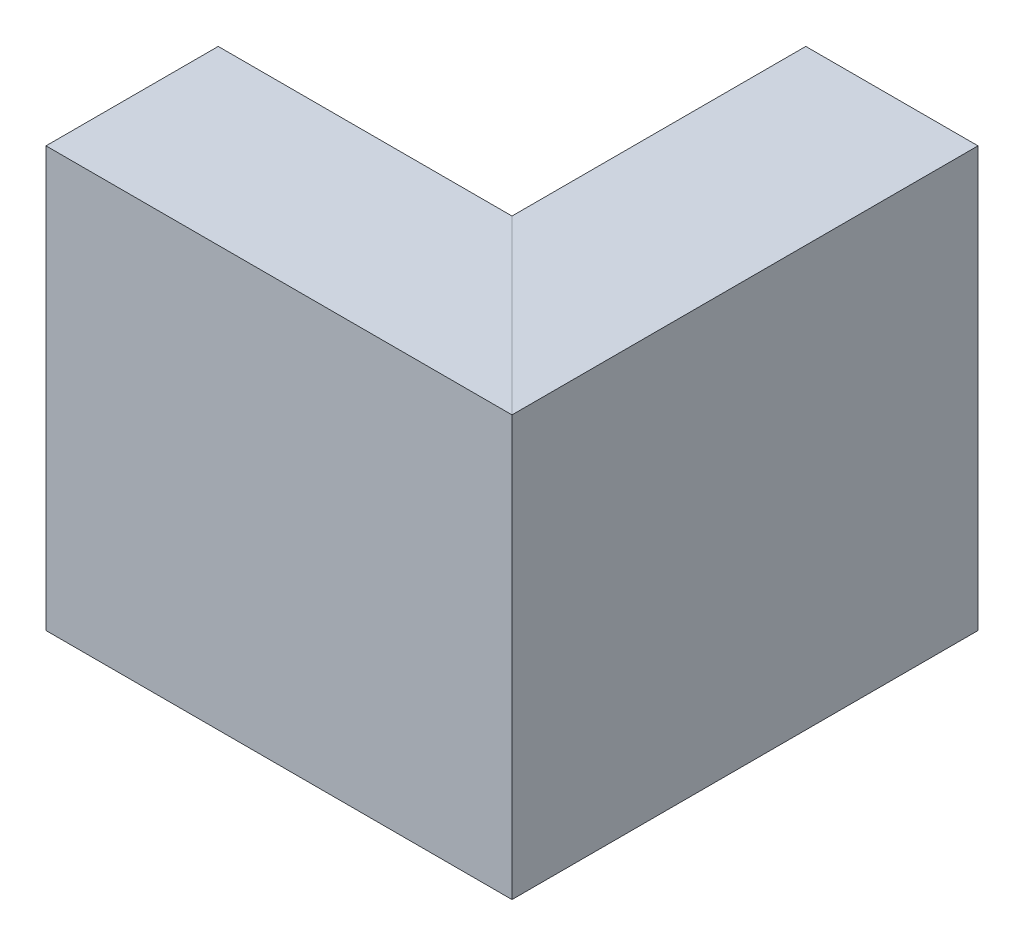
ISO-10303-21;
HEADER;
FILE_DESCRIPTION(('STEP AP214'),'2;1');
FILE_NAME('part.step','',(''),(''),'','','');
FILE_SCHEMA(('AUTOMOTIVE_DESIGN { 1 0 10303 214 1 1 1 1 }'));
ENDSEC;
DATA;
#1=APPLICATION_CONTEXT('core data for automotive mechanical design processes');
#2=APPLICATION_PROTOCOL_DEFINITION('international standard','automotive_design',2000,#1);
#3=PRODUCT_CONTEXT('',#1,'mechanical');
#4=PRODUCT('Part','Part','',(#3));
#5=PRODUCT_RELATED_PRODUCT_CATEGORY('part','',(#4));
#6=PRODUCT_DEFINITION_FORMATION('','',#4);
#7=PRODUCT_DEFINITION_CONTEXT('part definition',#1,'design');
#8=PRODUCT_DEFINITION('design','',#6,#7);
#9=PRODUCT_DEFINITION_SHAPE('','',#8);
#10=(LENGTH_UNIT() NAMED_UNIT(*) SI_UNIT(.MILLI.,.METRE.));
#11=(NAMED_UNIT(*) PLANE_ANGLE_UNIT() SI_UNIT($,.RADIAN.));
#12=(NAMED_UNIT(*) SI_UNIT($,.STERADIAN.) SOLID_ANGLE_UNIT());
#13=UNCERTAINTY_MEASURE_WITH_UNIT(LENGTH_MEASURE(1.E-05),#10,'distance_accuracy_value','');
#14=(GEOMETRIC_REPRESENTATION_CONTEXT(3) GLOBAL_UNCERTAINTY_ASSIGNED_CONTEXT((#13)) GLOBAL_UNIT_ASSIGNED_CONTEXT((#10,
#11,#12)) REPRESENTATION_CONTEXT('',''));
#15=CARTESIAN_POINT('',(0.,0.,0.));
#16=DIRECTION('',(0.,0.,1.));
#17=DIRECTION('',(1.,0.,0.));
#18=AXIS2_PLACEMENT_3D('',#15,#16,#17);
#19=CARTESIAN_POINT('',(4.849525,2.,14.73225));
#20=DIRECTION('',(0.,-0.0466159346990443,-0.998912886408086));
#21=DIRECTION('',(0.,0.998912886408087,-0.0466159346990443));
#22=AXIS2_PLACEMENT_3D('',#19,#20,#21);
#23=PLANE('',#22);
#24=DIRECTION('',(1.,0.,0.));
#25=VECTOR('',#24,1.);
#26=CARTESIAN_POINT('',(4.849525,0.,14.8255833333333));
#27=LINE('',#26,#25);
#28=CARTESIAN_POINT('',(-5.31775,0.,14.8255833333333));
#29=VERTEX_POINT('',#28);
#30=CARTESIAN_POINT('',(-4.22441666666667,0.,14.8255833333333));
#31=VERTEX_POINT('',#30);
#32=EDGE_CURVE('E60',#29,#31,#27,.T.);
#33=ORIENTED_EDGE('',*,*,#32,.F.);
#34=DIRECTION('',(0.,-0.998912886408087,0.0466159346990443));
#35=VECTOR('',#34,1.);
#36=CARTESIAN_POINT('',(-5.31775,2.,14.73225));
#37=LINE('',#36,#35);
#38=CARTESIAN_POINT('',(-5.31775,-22.225,15.86275));
#39=VERTEX_POINT('',#38);
#40=EDGE_CURVE('E201',#29,#39,#37,.T.);
#41=ORIENTED_EDGE('',*,*,#40,.T.);
#42=DIRECTION('',(-1.,0.,0.));
#43=VECTOR('',#42,1.);
#44=CARTESIAN_POINT('',(4.849525,-22.225,15.86275));
#45=LINE('',#44,#43);
#46=CARTESIAN_POINT('',(-19.05,-22.225,15.86275));
#47=VERTEX_POINT('',#46);
#48=EDGE_CURVE('E231',#39,#47,#45,.T.);
#49=ORIENTED_EDGE('',*,*,#48,.T.);
#50=DIRECTION('',(0.,-0.998912886408086,0.0466159346990443));
#51=VECTOR('',#50,1.);
#52=CARTESIAN_POINT('',(-19.05,2.,14.73225));
#53=LINE('',#52,#51);
#54=CARTESIAN_POINT('',(-19.05,2.,14.73225));
#55=VERTEX_POINT('',#54);
#56=EDGE_CURVE('E209',#55,#47,#53,.T.);
#57=ORIENTED_EDGE('',*,*,#56,.F.);
#58=DIRECTION('',(-1.,0.,0.));
#59=VECTOR('',#58,1.);
#60=CARTESIAN_POINT('',(4.849525,2.,14.73225));
#61=LINE('',#60,#59);
#62=CARTESIAN_POINT('',(-4.31775,2.,14.73225));
#63=VERTEX_POINT('',#62);
#64=EDGE_CURVE('E234',#63,#55,#61,.T.);
#65=ORIENTED_EDGE('',*,*,#64,.F.);
#66=DIRECTION('',(-0.046565367826734,0.997829310572866,-0.0465653678267339));
#67=VECTOR('',#66,1.);
#68=CARTESIAN_POINT('',(-4.34969443092309,2.68452351978051,14.7003055690769));
#69=LINE('',#68,#67);
#70=EDGE_CURVE('E274',#31,#63,#69,.T.);
#71=ORIENTED_EDGE('',*,*,#70,.F.);
#72=EDGE_LOOP('',(#33,#41,#49,#57,#65,#71));
#73=FACE_BOUND('',#72,.T.);
#74=ADVANCED_FACE('F39',(#73),#23,.T.);
#75=CARTESIAN_POINT('',(4.849525,-22.225,15.86275));
#76=DIRECTION('',(0.,-1.,0.));
#77=DIRECTION('',(0.,0.,-1.));
#78=AXIS2_PLACEMENT_3D('',#75,#76,#77);
#79=PLANE('',#78);
#80=ORIENTED_EDGE('',*,*,#48,.F.);
#81=DIRECTION('',(0.,0.,-1.));
#82=VECTOR('',#81,1.);
#83=CARTESIAN_POINT('',(-5.31775,-22.225,13.73225));
#84=LINE('',#83,#82);
#85=CARTESIAN_POINT('',(-5.31775,-22.225,17.7694166666667));
#86=VERTEX_POINT('',#85);
#87=EDGE_CURVE('E159',#86,#39,#84,.T.);
#88=ORIENTED_EDGE('',*,*,#87,.F.);
#89=DIRECTION('',(-1.,0.,0.));
#90=VECTOR('',#89,1.);
#91=CARTESIAN_POINT('',(4.849525,-22.225,17.7694166666667));
#92=LINE('',#91,#90);
#93=CARTESIAN_POINT('',(-19.05,-22.225,17.7694166666667));
#94=VERTEX_POINT('',#93);
#95=EDGE_CURVE('E228',#86,#94,#92,.T.);
#96=ORIENTED_EDGE('',*,*,#95,.T.);
#97=DIRECTION('',(0.,0.,1.));
#98=VECTOR('',#97,1.);
#99=CARTESIAN_POINT('',(-19.05,-22.225,15.86275));
#100=LINE('',#99,#98);
#101=EDGE_CURVE('E205',#47,#94,#100,.T.);
#102=ORIENTED_EDGE('',*,*,#101,.F.);
#103=EDGE_LOOP('',(#80,#88,#96,#102));
#104=FACE_BOUND('',#103,.T.);
#105=ADVANCED_FACE('F355',(#104),#79,.T.);
#106=CARTESIAN_POINT('',(4.849525,-22.225,17.7694166666667));
#107=DIRECTION('',(0.,0.0466159346990442,0.998912886408086));
#108=DIRECTION('',(0.,-0.998912886408087,0.0466159346990442));
#109=AXIS2_PLACEMENT_3D('',#106,#107,#108);
#110=PLANE('',#109);
#111=ORIENTED_EDGE('',*,*,#95,.F.);
#112=DIRECTION('',(0.,0.998912886408087,-0.0466159346990442));
#113=VECTOR('',#112,1.);
#114=CARTESIAN_POINT('',(-5.31775,-22.225,17.7694166666667));
#115=LINE('',#114,#113);
#116=CARTESIAN_POINT('',(-5.31775,0.,16.73225));
#117=VERTEX_POINT('',#116);
#118=EDGE_CURVE('E170',#86,#117,#115,.T.);
#119=ORIENTED_EDGE('',*,*,#118,.T.);
#120=DIRECTION('',(-1.,0.,0.));
#121=VECTOR('',#120,1.);
#122=CARTESIAN_POINT('',(4.849525,0.,16.73225));
#123=LINE('',#122,#121);
#124=CARTESIAN_POINT('',(-19.05,0.,16.73225));
#125=VERTEX_POINT('',#124);
#126=EDGE_CURVE('E225',#117,#125,#123,.T.);
#127=ORIENTED_EDGE('',*,*,#126,.T.);
#128=DIRECTION('',(0.,0.998912886408086,-0.0466159346990442));
#129=VECTOR('',#128,1.);
#130=CARTESIAN_POINT('',(-19.05,-22.225,17.7694166666667));
#131=LINE('',#130,#129);
#132=EDGE_CURVE('E200',#94,#125,#131,.T.);
#133=ORIENTED_EDGE('',*,*,#132,.F.);
#134=EDGE_LOOP('',(#111,#119,#127,#133));
#135=FACE_BOUND('',#134,.T.);
#136=ADVANCED_FACE('F359',(#135),#110,.T.);
#137=CARTESIAN_POINT('',(-1.28058333333333,-22.225,0.));
#138=DIRECTION('',(0.998912886408086,0.0466159346990442,0.));
#139=DIRECTION('',(-0.0466159346990442,0.998912886408086,0.));
#140=AXIS2_PLACEMENT_3D('',#137,#138,#139);
#141=PLANE('',#140);
#142=DIRECTION('',(0.,0.,1.));
#143=VECTOR('',#142,1.);
#144=CARTESIAN_POINT('',(-2.31775,0.,0.));
#145=LINE('',#144,#143);
#146=CARTESIAN_POINT('',(-2.31775,0.,0.));
#147=VERTEX_POINT('',#146);
#148=CARTESIAN_POINT('',(-2.31775,0.,13.73225));
#149=VERTEX_POINT('',#148);
#150=EDGE_CURVE('E168',#147,#149,#145,.T.);
#151=ORIENTED_EDGE('',*,*,#150,.T.);
#152=DIRECTION('',(0.0466159346990442,-0.998912886408086,0.));
#153=VECTOR('',#152,1.);
#154=CARTESIAN_POINT('',(-1.28058333333333,-22.225,13.73225));
#155=LINE('',#154,#153);
#156=CARTESIAN_POINT('',(-1.28058333333333,-22.225,13.73225));
#157=VERTEX_POINT('',#156);
#158=EDGE_CURVE('E152',#149,#157,#155,.T.);
#159=ORIENTED_EDGE('',*,*,#158,.T.);
#160=DIRECTION('',(0.,0.,1.));
#161=VECTOR('',#160,1.);
#162=CARTESIAN_POINT('',(-1.28058333333333,-22.225,0.));
#163=LINE('',#162,#161);
#164=CARTESIAN_POINT('',(-1.28058333333333,-22.225,0.));
#165=VERTEX_POINT('',#164);
#166=EDGE_CURVE('E166',#165,#157,#163,.T.);
#167=ORIENTED_EDGE('',*,*,#166,.F.);
#168=DIRECTION('',(-0.0466159346990442,0.998912886408086,0.));
#169=VECTOR('',#168,1.);
#170=CARTESIAN_POINT('',(-1.28058333333333,-22.225,0.));
#171=LINE('',#170,#169);
#172=EDGE_CURVE('E186',#165,#147,#171,.T.);
#173=ORIENTED_EDGE('',*,*,#172,.T.);
#174=EDGE_LOOP('',(#151,#159,#167,#173));
#175=FACE_BOUND('',#174,.T.);
#176=ADVANCED_FACE('F164',(#175),#141,.T.);
#177=CARTESIAN_POINT('',(-3.18725,-22.225,0.));
#178=DIRECTION('',(0.,-1.,0.));
#179=DIRECTION('',(1.,0.,0.));
#180=AXIS2_PLACEMENT_3D('',#177,#178,#179);
#181=PLANE('',#180);
#182=ORIENTED_EDGE('',*,*,#166,.T.);
#183=DIRECTION('',(1.,0.,0.));
#184=VECTOR('',#183,1.);
#185=CARTESIAN_POINT('',(-5.31775,-22.225,13.73225));
#186=LINE('',#185,#184);
#187=CARTESIAN_POINT('',(-3.18724999999999,-22.225,13.73225));
#188=VERTEX_POINT('',#187);
#189=EDGE_CURVE('E148',#188,#157,#186,.T.);
#190=ORIENTED_EDGE('',*,*,#189,.F.);
#191=DIRECTION('',(0.,0.,1.));
#192=VECTOR('',#191,1.);
#193=CARTESIAN_POINT('',(-3.18725,-22.225,0.));
#194=LINE('',#193,#192);
#195=CARTESIAN_POINT('',(-3.18725,-22.225,0.));
#196=VERTEX_POINT('',#195);
#197=EDGE_CURVE('E176',#196,#188,#194,.T.);
#198=ORIENTED_EDGE('',*,*,#197,.F.);
#199=DIRECTION('',(1.,0.,0.));
#200=VECTOR('',#199,1.);
#201=CARTESIAN_POINT('',(-3.18725,-22.225,0.));
#202=LINE('',#201,#200);
#203=EDGE_CURVE('E174',#196,#165,#202,.T.);
#204=ORIENTED_EDGE('',*,*,#203,.T.);
#205=EDGE_LOOP('',(#182,#190,#198,#204));
#206=FACE_BOUND('',#205,.T.);
#207=ADVANCED_FACE('F173',(#206),#181,.T.);
#208=CARTESIAN_POINT('',(-4.31775,2.,0.));
#209=DIRECTION('',(-0.998912886408086,-0.0466159346990443,0.));
#210=DIRECTION('',(0.0466159346990443,-0.998912886408086,0.));
#211=AXIS2_PLACEMENT_3D('',#208,#209,#210);
#212=PLANE('',#211);
#213=ORIENTED_EDGE('',*,*,#197,.T.);
#214=DIRECTION('',(-0.0466159346990443,0.998912886408086,0.));
#215=VECTOR('',#214,1.);
#216=CARTESIAN_POINT('',(-4.31775,2.,13.73225));
#217=LINE('',#216,#215);
#218=CARTESIAN_POINT('',(-4.22441666666667,0.,13.73225));
#219=VERTEX_POINT('',#218);
#220=EDGE_CURVE('E11',#188,#219,#217,.T.);
#221=ORIENTED_EDGE('',*,*,#220,.T.);
#222=DIRECTION('',(0.,0.,-1.));
#223=VECTOR('',#222,1.);
#224=CARTESIAN_POINT('',(-4.22441666666667,0.,0.));
#225=LINE('',#224,#223);
#226=EDGE_CURVE('E48',#31,#219,#225,.T.);
#227=ORIENTED_EDGE('',*,*,#226,.F.);
#228=ORIENTED_EDGE('',*,*,#70,.T.);
#229=DIRECTION('',(0.,0.,1.));
#230=VECTOR('',#229,1.);
#231=CARTESIAN_POINT('',(-4.31775,2.,0.));
#232=LINE('',#231,#230);
#233=CARTESIAN_POINT('',(-4.31775,2.,0.));
#234=VERTEX_POINT('',#233);
#235=EDGE_CURVE('E182',#234,#63,#232,.T.);
#236=ORIENTED_EDGE('',*,*,#235,.F.);
#237=DIRECTION('',(0.0466159346990443,-0.998912886408086,0.));
#238=VECTOR('',#237,1.);
#239=CARTESIAN_POINT('',(-4.31775,2.,0.));
#240=LINE('',#239,#238);
#241=EDGE_CURVE('E306',#234,#196,#240,.T.);
#242=ORIENTED_EDGE('',*,*,#241,.T.);
#243=EDGE_LOOP('',(#213,#221,#227,#228,#236,#242));
#244=FACE_BOUND('',#243,.T.);
#245=ADVANCED_FACE('F315',(#244),#212,.T.);
#246=CARTESIAN_POINT('',(-19.05,0.,19.05));
#247=DIRECTION('',(-1.,0.,0.));
#248=DIRECTION('',(0.,0.,1.));
#249=AXIS2_PLACEMENT_3D('',#246,#247,#248);
#250=PLANE('',#249);
#251=DIRECTION('',(0.,-1.,0.));
#252=VECTOR('',#251,1.);
#253=CARTESIAN_POINT('',(-19.05,0.,21.36775));
#254=LINE('',#253,#252);
#255=CARTESIAN_POINT('',(-19.05,0.,21.36775));
#256=VERTEX_POINT('',#255);
#257=CARTESIAN_POINT('',(-19.05,-19.05,21.36775));
#258=VERTEX_POINT('',#257);
#259=EDGE_CURVE('E222',#256,#258,#254,.T.);
#260=ORIENTED_EDGE('',*,*,#259,.T.);
#261=DIRECTION('',(0.,0.,1.));
#262=VECTOR('',#261,1.);
#263=CARTESIAN_POINT('',(-19.05,-19.05,21.36775));
#264=LINE('',#263,#262);
#265=CARTESIAN_POINT('',(-19.05,-19.05,23.36775));
#266=VERTEX_POINT('',#265);
#267=EDGE_CURVE('E219',#258,#266,#264,.T.);
#268=ORIENTED_EDGE('',*,*,#267,.T.);
#269=DIRECTION('',(0.,1.,0.));
#270=VECTOR('',#269,1.);
#271=CARTESIAN_POINT('',(-19.05,-19.05,23.36775));
#272=LINE('',#271,#270);
#273=CARTESIAN_POINT('',(-19.05,2.,23.36775));
#274=VERTEX_POINT('',#273);
#275=EDGE_CURVE('E216',#266,#274,#272,.T.);
#276=ORIENTED_EDGE('',*,*,#275,.T.);
#277=DIRECTION('',(0.,0.,-1.));
#278=VECTOR('',#277,1.);
#279=CARTESIAN_POINT('',(-19.05,2.,23.36775));
#280=LINE('',#279,#278);
#281=EDGE_CURVE('E213',#274,#55,#280,.T.);
#282=ORIENTED_EDGE('',*,*,#281,.T.);
#283=ORIENTED_EDGE('',*,*,#56,.T.);
#284=ORIENTED_EDGE('',*,*,#101,.T.);
#285=ORIENTED_EDGE('',*,*,#132,.T.);
#286=DIRECTION('',(0.,0.,1.));
#287=VECTOR('',#286,1.);
#288=CARTESIAN_POINT('',(-19.05,0.,16.73225));
#289=LINE('',#288,#287);
#290=EDGE_CURVE('E197',#125,#256,#289,.T.);
#291=ORIENTED_EDGE('',*,*,#290,.T.);
#292=EDGE_LOOP('',(#260,#268,#276,#282,#283,#284,#285,#291));
#293=FACE_BOUND('',#292,.T.);
#294=ADVANCED_FACE('F41',(#293),#250,.T.);
#295=CARTESIAN_POINT('',(0.,0.,0.));
#296=DIRECTION('',(0.,0.,1.));
#297=DIRECTION('',(1.,0.,0.));
#298=AXIS2_PLACEMENT_3D('',#295,#296,#297);
#299=PLANE('',#298);
#300=DIRECTION('',(0.,-1.,0.));
#301=VECTOR('',#300,1.);
#302=CARTESIAN_POINT('',(2.31775,0.,0.));
#303=LINE('',#302,#301);
#304=CARTESIAN_POINT('',(2.31775,0.,0.));
#305=VERTEX_POINT('',#304);
#306=CARTESIAN_POINT('',(2.31775,-19.05,0.));
#307=VERTEX_POINT('',#306);
#308=EDGE_CURVE('E253',#305,#307,#303,.T.);
#309=ORIENTED_EDGE('',*,*,#308,.F.);
#310=DIRECTION('',(1.,0.,0.));
#311=VECTOR('',#310,1.);
#312=CARTESIAN_POINT('',(-2.31775,0.,0.));
#313=LINE('',#312,#311);
#314=EDGE_CURVE('E188',#147,#305,#313,.T.);
#315=ORIENTED_EDGE('',*,*,#314,.F.);
#316=ORIENTED_EDGE('',*,*,#172,.F.);
#317=ORIENTED_EDGE('',*,*,#203,.F.);
#318=ORIENTED_EDGE('',*,*,#241,.F.);
#319=DIRECTION('',(-1.,0.,0.));
#320=VECTOR('',#319,1.);
#321=CARTESIAN_POINT('',(4.31775,2.,0.));
#322=LINE('',#321,#320);
#323=CARTESIAN_POINT('',(4.31775,2.,0.));
#324=VERTEX_POINT('',#323);
#325=EDGE_CURVE('E299',#324,#234,#322,.T.);
#326=ORIENTED_EDGE('',*,*,#325,.F.);
#327=DIRECTION('',(0.,1.,0.));
#328=VECTOR('',#327,1.);
#329=CARTESIAN_POINT('',(4.31775,-19.05,0.));
#330=LINE('',#329,#328);
#331=CARTESIAN_POINT('',(4.31775,-19.05,0.));
#332=VERTEX_POINT('',#331);
#333=EDGE_CURVE('E292',#332,#324,#330,.T.);
#334=ORIENTED_EDGE('',*,*,#333,.F.);
#335=DIRECTION('',(1.,0.,0.));
#336=VECTOR('',#335,1.);
#337=CARTESIAN_POINT('',(2.31775,-19.05,0.));
#338=LINE('',#337,#336);
#339=EDGE_CURVE('E282',#307,#332,#338,.T.);
#340=ORIENTED_EDGE('',*,*,#339,.F.);
#341=EDGE_LOOP('',(#309,#315,#316,#317,#318,#326,#334,#340));
#342=FACE_BOUND('',#341,.T.);
#343=ADVANCED_FACE('F317',(#342),#299,.F.);
#344=CARTESIAN_POINT('',(4.849525,0.,21.36775));
#345=DIRECTION('',(0.,0.,-1.));
#346=DIRECTION('',(-1.,0.,0.));
#347=AXIS2_PLACEMENT_3D('',#344,#345,#346);
#348=PLANE('',#347);
#349=DIRECTION('',(0.,1.,0.));
#350=VECTOR('',#349,1.);
#351=CARTESIAN_POINT('',(2.31775,0.,21.36775));
#352=LINE('',#351,#350);
#353=CARTESIAN_POINT('',(2.31775,-19.05,21.36775));
#354=VERTEX_POINT('',#353);
#355=CARTESIAN_POINT('',(2.31775,0.,21.36775));
#356=VERTEX_POINT('',#355);
#357=EDGE_CURVE('E180',#354,#356,#352,.T.);
#358=ORIENTED_EDGE('',*,*,#357,.F.);
#359=DIRECTION('',(-1.,0.,0.));
#360=VECTOR('',#359,1.);
#361=CARTESIAN_POINT('',(4.849525,-19.05,21.36775));
#362=LINE('',#361,#360);
#363=EDGE_CURVE('E246',#354,#258,#362,.T.);
#364=ORIENTED_EDGE('',*,*,#363,.T.);
#365=ORIENTED_EDGE('',*,*,#259,.F.);
#366=DIRECTION('',(-1.,0.,0.));
#367=VECTOR('',#366,1.);
#368=CARTESIAN_POINT('',(4.849525,0.,21.36775));
#369=LINE('',#368,#367);
#370=EDGE_CURVE('E250',#356,#256,#369,.T.);
#371=ORIENTED_EDGE('',*,*,#370,.F.);
#372=EDGE_LOOP('',(#358,#364,#365,#371));
#373=FACE_BOUND('',#372,.T.);
#374=ADVANCED_FACE('F364',(#373),#348,.T.);
#375=CARTESIAN_POINT('',(4.849525,-19.05,21.36775));
#376=DIRECTION('',(0.,-1.,0.));
#377=DIRECTION('',(0.,0.,-1.));
#378=AXIS2_PLACEMENT_3D('',#375,#376,#377);
#379=PLANE('',#378);
#380=DIRECTION('',(-0.707106781186548,0.,-0.707106781186547));
#381=VECTOR('',#380,1.);
#382=CARTESIAN_POINT('',(-8.366125,-19.05,10.683875));
#383=LINE('',#382,#381);
#384=CARTESIAN_POINT('',(4.31775,-19.05,23.36775));
#385=VERTEX_POINT('',#384);
#386=EDGE_CURVE('E255',#385,#354,#383,.T.);
#387=ORIENTED_EDGE('',*,*,#386,.F.);
#388=DIRECTION('',(-1.,0.,0.));
#389=VECTOR('',#388,1.);
#390=CARTESIAN_POINT('',(4.849525,-19.05,23.36775));
#391=LINE('',#390,#389);
#392=EDGE_CURVE('E242',#385,#266,#391,.T.);
#393=ORIENTED_EDGE('',*,*,#392,.T.);
#394=ORIENTED_EDGE('',*,*,#267,.F.);
#395=ORIENTED_EDGE('',*,*,#363,.F.);
#396=EDGE_LOOP('',(#387,#393,#394,#395));
#397=FACE_BOUND('',#396,.T.);
#398=ADVANCED_FACE('F367',(#397),#379,.T.);
#399=CARTESIAN_POINT('',(4.849525,-19.05,23.36775));
#400=DIRECTION('',(0.,0.,1.));
#401=DIRECTION('',(1.,0.,0.));
#402=AXIS2_PLACEMENT_3D('',#399,#400,#401);
#403=PLANE('',#402);
#404=DIRECTION('',(0.,-1.,0.));
#405=VECTOR('',#404,1.);
#406=CARTESIAN_POINT('',(4.31775,-19.05,23.36775));
#407=LINE('',#406,#405);
#408=CARTESIAN_POINT('',(4.31775,2.,23.36775));
#409=VERTEX_POINT('',#408);
#410=EDGE_CURVE('E258',#409,#385,#407,.T.);
#411=ORIENTED_EDGE('',*,*,#410,.F.);
#412=DIRECTION('',(-1.,0.,0.));
#413=VECTOR('',#412,1.);
#414=CARTESIAN_POINT('',(4.849525,2.,23.36775));
#415=LINE('',#414,#413);
#416=EDGE_CURVE('E238',#409,#274,#415,.T.);
#417=ORIENTED_EDGE('',*,*,#416,.T.);
#418=ORIENTED_EDGE('',*,*,#275,.F.);
#419=ORIENTED_EDGE('',*,*,#392,.F.);
#420=EDGE_LOOP('',(#411,#417,#418,#419));
#421=FACE_BOUND('',#420,.T.);
#422=ADVANCED_FACE('F372',(#421),#403,.T.);
#423=CARTESIAN_POINT('',(4.849525,2.,23.36775));
#424=DIRECTION('',(0.,1.,0.));
#425=DIRECTION('',(0.,0.,1.));
#426=AXIS2_PLACEMENT_3D('',#423,#424,#425);
#427=PLANE('',#426);
#428=DIRECTION('',(0.707106781186548,0.,0.707106781186547));
#429=VECTOR('',#428,1.);
#430=CARTESIAN_POINT('',(-7.366125,2.,11.683875));
#431=LINE('',#430,#429);
#432=EDGE_CURVE('E266',#63,#409,#431,.T.);
#433=ORIENTED_EDGE('',*,*,#432,.F.);
#434=ORIENTED_EDGE('',*,*,#64,.T.);
#435=ORIENTED_EDGE('',*,*,#281,.F.);
#436=ORIENTED_EDGE('',*,*,#416,.F.);
#437=EDGE_LOOP('',(#433,#434,#435,#436));
#438=FACE_BOUND('',#437,.T.);
#439=ADVANCED_FACE('F375',(#438),#427,.T.);
#440=CARTESIAN_POINT('',(-2.31775,0.,0.));
#441=DIRECTION('',(0.,-1.,0.));
#442=DIRECTION('',(0.,0.,-1.));
#443=AXIS2_PLACEMENT_3D('',#440,#441,#442);
#444=PLANE('',#443);
#445=ORIENTED_EDGE('',*,*,#370,.T.);
#446=ORIENTED_EDGE('',*,*,#290,.F.);
#447=ORIENTED_EDGE('',*,*,#126,.F.);
#448=DIRECTION('',(0.,0.,-1.));
#449=VECTOR('',#448,1.);
#450=CARTESIAN_POINT('',(-5.31775,0.,13.73225));
#451=LINE('',#450,#449);
#452=EDGE_CURVE('E332',#117,#29,#451,.T.);
#453=ORIENTED_EDGE('',*,*,#452,.T.);
#454=ORIENTED_EDGE('',*,*,#32,.T.);
#455=ORIENTED_EDGE('',*,*,#226,.T.);
#456=DIRECTION('',(1.,0.,0.));
#457=VECTOR('',#456,1.);
#458=CARTESIAN_POINT('',(-5.31775,0.,13.73225));
#459=LINE('',#458,#457);
#460=EDGE_CURVE('E330',#219,#149,#459,.T.);
#461=ORIENTED_EDGE('',*,*,#460,.T.);
#462=ORIENTED_EDGE('',*,*,#150,.F.);
#463=ORIENTED_EDGE('',*,*,#314,.T.);
#464=DIRECTION('',(0.,0.,1.));
#465=VECTOR('',#464,1.);
#466=CARTESIAN_POINT('',(2.31775,0.,0.));
#467=LINE('',#466,#465);
#468=EDGE_CURVE('E193',#305,#356,#467,.T.);
#469=ORIENTED_EDGE('',*,*,#468,.T.);
#470=EDGE_LOOP('',(#445,#446,#447,#453,#454,#455,#461,#462,#463,#469));
#471=FACE_BOUND('',#470,.T.);
#472=ADVANCED_FACE('F329',(#471),#444,.T.);
#473=CARTESIAN_POINT('',(4.31775,2.,0.));
#474=DIRECTION('',(0.,1.,0.));
#475=DIRECTION('',(0.,0.,1.));
#476=AXIS2_PLACEMENT_3D('',#473,#474,#475);
#477=PLANE('',#476);
#478=ORIENTED_EDGE('',*,*,#235,.T.);
#479=ORIENTED_EDGE('',*,*,#432,.T.);
#480=DIRECTION('',(0.,0.,1.));
#481=VECTOR('',#480,1.);
#482=CARTESIAN_POINT('',(4.31775,2.,0.));
#483=LINE('',#482,#481);
#484=EDGE_CURVE('E295',#324,#409,#483,.T.);
#485=ORIENTED_EDGE('',*,*,#484,.F.);
#486=ORIENTED_EDGE('',*,*,#325,.T.);
#487=EDGE_LOOP('',(#478,#479,#485,#486));
#488=FACE_BOUND('',#487,.T.);
#489=ADVANCED_FACE('F320',(#488),#477,.T.);
#490=CARTESIAN_POINT('',(4.31775,-19.05,0.));
#491=DIRECTION('',(1.,0.,0.));
#492=DIRECTION('',(0.,0.,-1.));
#493=AXIS2_PLACEMENT_3D('',#490,#491,#492);
#494=PLANE('',#493);
#495=ORIENTED_EDGE('',*,*,#484,.T.);
#496=ORIENTED_EDGE('',*,*,#410,.T.);
#497=DIRECTION('',(0.,0.,1.));
#498=VECTOR('',#497,1.);
#499=CARTESIAN_POINT('',(4.31775,-19.05,0.));
#500=LINE('',#499,#498);
#501=EDGE_CURVE('E286',#332,#385,#500,.T.);
#502=ORIENTED_EDGE('',*,*,#501,.F.);
#503=ORIENTED_EDGE('',*,*,#333,.T.);
#504=EDGE_LOOP('',(#495,#496,#502,#503));
#505=FACE_BOUND('',#504,.T.);
#506=ADVANCED_FACE('F323',(#505),#494,.T.);
#507=CARTESIAN_POINT('',(2.31775,-19.05,0.));
#508=DIRECTION('',(0.,-1.,0.));
#509=DIRECTION('',(0.,0.,-1.));
#510=AXIS2_PLACEMENT_3D('',#507,#508,#509);
#511=PLANE('',#510);
#512=ORIENTED_EDGE('',*,*,#501,.T.);
#513=ORIENTED_EDGE('',*,*,#386,.T.);
#514=DIRECTION('',(0.,0.,1.));
#515=VECTOR('',#514,1.);
#516=CARTESIAN_POINT('',(2.31775,-19.05,0.));
#517=LINE('',#516,#515);
#518=EDGE_CURVE('E283',#307,#354,#517,.T.);
#519=ORIENTED_EDGE('',*,*,#518,.F.);
#520=ORIENTED_EDGE('',*,*,#339,.T.);
#521=EDGE_LOOP('',(#512,#513,#519,#520));
#522=FACE_BOUND('',#521,.T.);
#523=ADVANCED_FACE('F325',(#522),#511,.T.);
#524=CARTESIAN_POINT('',(2.31775,0.,0.));
#525=DIRECTION('',(-1.,0.,0.));
#526=DIRECTION('',(0.,-1.,0.));
#527=AXIS2_PLACEMENT_3D('',#524,#525,#526);
#528=PLANE('',#527);
#529=ORIENTED_EDGE('',*,*,#518,.T.);
#530=ORIENTED_EDGE('',*,*,#357,.T.);
#531=ORIENTED_EDGE('',*,*,#468,.F.);
#532=ORIENTED_EDGE('',*,*,#308,.T.);
#533=EDGE_LOOP('',(#529,#530,#531,#532));
#534=FACE_BOUND('',#533,.T.);
#535=ADVANCED_FACE('F327',(#534),#528,.T.);
#536=CARTESIAN_POINT('',(-5.31775,-22.225,13.73225));
#537=DIRECTION('',(1.,0.,0.));
#538=DIRECTION('',(0.,1.,0.));
#539=AXIS2_PLACEMENT_3D('',#536,#537,#538);
#540=PLANE('',#539);
#541=ORIENTED_EDGE('',*,*,#452,.F.);
#542=ORIENTED_EDGE('',*,*,#118,.F.);
#543=ORIENTED_EDGE('',*,*,#87,.T.);
#544=ORIENTED_EDGE('',*,*,#40,.F.);
#545=EDGE_LOOP('',(#541,#542,#543,#544));
#546=FACE_BOUND('',#545,.T.);
#547=ADVANCED_FACE('F399',(#546),#540,.T.);
#548=CARTESIAN_POINT('',(-5.31775,-22.225,13.73225));
#549=DIRECTION('',(0.,0.,1.));
#550=DIRECTION('',(1.,0.,0.));
#551=AXIS2_PLACEMENT_3D('',#548,#549,#550);
#552=PLANE('',#551);
#553=ORIENTED_EDGE('',*,*,#460,.F.);
#554=ORIENTED_EDGE('',*,*,#220,.F.);
#555=ORIENTED_EDGE('',*,*,#189,.T.);
#556=ORIENTED_EDGE('',*,*,#158,.F.);
#557=EDGE_LOOP('',(#553,#554,#555,#556));
#558=FACE_BOUND('',#557,.T.);
#559=ADVANCED_FACE('F151',(#558),#552,.T.);
#560=CLOSED_SHELL('',(#74,#105,#136,#176,#207,#245,#294,#343,#374,#398,#422,#439,#472,#489,#506,
#523,#535,#547,#559));
#561=MANIFOLD_SOLID_BREP('B2',#560);
#562=ADVANCED_BREP_SHAPE_REPRESENTATION('',(#18,#561),#14);
#563=SHAPE_DEFINITION_REPRESENTATION(#9,#562);
ENDSEC;
END-ISO-10303-21;
